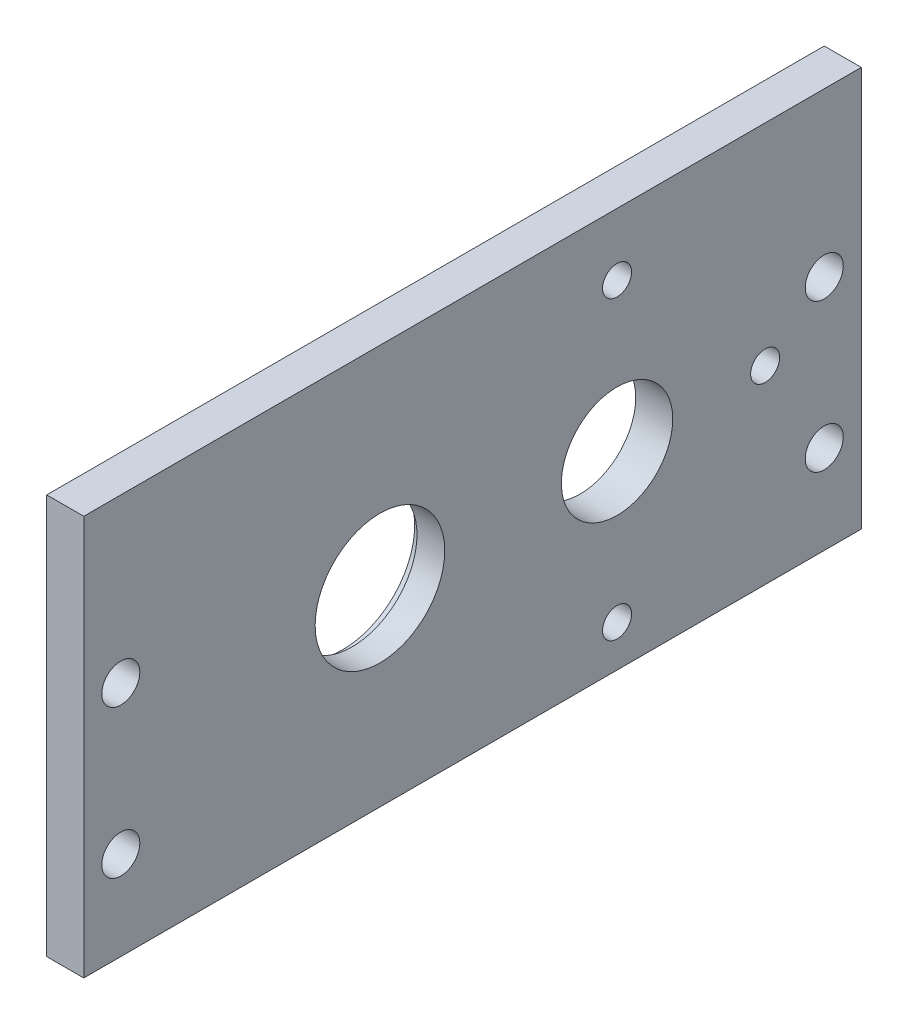
ISO-10303-21;
HEADER;
FILE_DESCRIPTION(('STEP AP214'),'2;1');
FILE_NAME('part.step','',(''),(''),'','','');
FILE_SCHEMA(('AUTOMOTIVE_DESIGN { 1 0 10303 214 1 1 1 1 }'));
ENDSEC;
DATA;
#1=APPLICATION_CONTEXT('core data for automotive mechanical design processes');
#2=APPLICATION_PROTOCOL_DEFINITION('international standard','automotive_design',2000,#1);
#3=PRODUCT_CONTEXT('',#1,'mechanical');
#4=PRODUCT('Part','Part','',(#3));
#5=PRODUCT_RELATED_PRODUCT_CATEGORY('part','',(#4));
#6=PRODUCT_DEFINITION_FORMATION('','',#4);
#7=PRODUCT_DEFINITION_CONTEXT('part definition',#1,'design');
#8=PRODUCT_DEFINITION('design','',#6,#7);
#9=PRODUCT_DEFINITION_SHAPE('','',#8);
#10=(LENGTH_UNIT() NAMED_UNIT(*) SI_UNIT(.MILLI.,.METRE.));
#11=(NAMED_UNIT(*) PLANE_ANGLE_UNIT() SI_UNIT($,.RADIAN.));
#12=(NAMED_UNIT(*) SI_UNIT($,.STERADIAN.) SOLID_ANGLE_UNIT());
#13=UNCERTAINTY_MEASURE_WITH_UNIT(LENGTH_MEASURE(1.E-05),#10,'distance_accuracy_value','');
#14=(GEOMETRIC_REPRESENTATION_CONTEXT(3) GLOBAL_UNCERTAINTY_ASSIGNED_CONTEXT((#13)) GLOBAL_UNIT_ASSIGNED_CONTEXT((#10,
#11,#12)) REPRESENTATION_CONTEXT('',''));
#15=CARTESIAN_POINT('',(0.,0.,0.));
#16=DIRECTION('',(0.,0.,1.));
#17=DIRECTION('',(1.,0.,0.));
#18=AXIS2_PLACEMENT_3D('',#15,#16,#17);
#19=CARTESIAN_POINT('',(6.35,0.,0.));
#20=DIRECTION('',(-1.,0.,0.));
#21=DIRECTION('',(0.,0.,1.));
#22=AXIS2_PLACEMENT_3D('',#19,#20,#21);
#23=CYLINDRICAL_SURFACE('',#22,11.1125);
#24=CARTESIAN_POINT('',(6.35,0.,0.));
#25=DIRECTION('',(1.,0.,0.));
#26=DIRECTION('',(0.,0.,-1.));
#27=AXIS2_PLACEMENT_3D('',#24,#25,#26);
#28=CIRCLE('',#27,11.1125);
#29=CARTESIAN_POINT('',(6.35,0.,-11.1125));
#30=VERTEX_POINT('',#29);
#31=EDGE_CURVE('E107',#30,#30,#28,.T.);
#32=ORIENTED_EDGE('',*,*,#31,.T.);
#33=EDGE_LOOP('',(#32));
#34=FACE_BOUND('',#33,.T.);
#35=CARTESIAN_POINT('',(1.5875,0.,0.));
#36=DIRECTION('',(-1.,0.,0.));
#37=DIRECTION('',(0.,0.,1.));
#38=AXIS2_PLACEMENT_3D('',#35,#36,#37);
#39=CIRCLE('',#38,11.1125);
#40=CARTESIAN_POINT('',(1.5875,0.,11.1125));
#41=VERTEX_POINT('',#40);
#42=EDGE_CURVE('E41',#41,#41,#39,.T.);
#43=ORIENTED_EDGE('',*,*,#42,.T.);
#44=EDGE_LOOP('',(#43));
#45=FACE_BOUND('',#44,.T.);
#46=ADVANCED_FACE('F37',(#34,#45),#23,.F.);
#47=CARTESIAN_POINT('',(6.35,0.,0.));
#48=DIRECTION('',(1.,0.,0.));
#49=DIRECTION('',(0.,0.,-1.));
#50=AXIS2_PLACEMENT_3D('',#47,#48,#49);
#51=PLANE('',#50);
#52=CARTESIAN_POINT('',(6.35,-17.272,44.45));
#53=DIRECTION('',(1.,0.,0.));
#54=DIRECTION('',(0.,0.,-1.));
#55=AXIS2_PLACEMENT_3D('',#52,#53,#54);
#56=CIRCLE('',#55,3.2639);
#57=CARTESIAN_POINT('',(6.35,-17.272,41.1861));
#58=VERTEX_POINT('',#57);
#59=EDGE_CURVE('E155',#58,#58,#56,.T.);
#60=ORIENTED_EDGE('',*,*,#59,.F.);
#61=EDGE_LOOP('',(#60));
#62=FACE_BOUND('',#61,.T.);
#63=CARTESIAN_POINT('',(6.35,-17.272,-76.2));
#64=DIRECTION('',(1.,0.,0.));
#65=DIRECTION('',(0.,0.,-1.));
#66=AXIS2_PLACEMENT_3D('',#63,#64,#65);
#67=CIRCLE('',#66,3.26389999999999);
#68=CARTESIAN_POINT('',(6.35,-17.272,-79.4639));
#69=VERTEX_POINT('',#68);
#70=EDGE_CURVE('E143',#69,#69,#67,.T.);
#71=ORIENTED_EDGE('',*,*,#70,.F.);
#72=EDGE_LOOP('',(#71));
#73=FACE_BOUND('',#72,.T.);
#74=CARTESIAN_POINT('',(6.35,-25.4,-40.6654));
#75=DIRECTION('',(1.,0.,0.));
#76=DIRECTION('',(0.,0.,-1.));
#77=AXIS2_PLACEMENT_3D('',#74,#75,#76);
#78=CIRCLE('',#77,2.4892);
#79=CARTESIAN_POINT('',(6.35,-25.4,-43.1546));
#80=VERTEX_POINT('',#79);
#81=EDGE_CURVE('E131',#80,#80,#78,.T.);
#82=ORIENTED_EDGE('',*,*,#81,.F.);
#83=EDGE_LOOP('',(#82));
#84=FACE_BOUND('',#83,.T.);
#85=CARTESIAN_POINT('',(6.35,25.4,-40.6654));
#86=DIRECTION('',(1.,0.,0.));
#87=DIRECTION('',(0.,0.,-1.));
#88=AXIS2_PLACEMENT_3D('',#85,#86,#87);
#89=CIRCLE('',#88,2.4892);
#90=CARTESIAN_POINT('',(6.35,25.4,-43.1546));
#91=VERTEX_POINT('',#90);
#92=EDGE_CURVE('E121',#91,#91,#89,.T.);
#93=ORIENTED_EDGE('',*,*,#92,.F.);
#94=EDGE_LOOP('',(#93));
#95=FACE_BOUND('',#94,.T.);
#96=DIRECTION('',(0.,-1.,0.));
#97=VECTOR('',#96,1.);
#98=CARTESIAN_POINT('',(6.35,36.068,50.8));
#99=LINE('',#98,#97);
#100=CARTESIAN_POINT('',(6.35,36.068,50.8));
#101=VERTEX_POINT('',#100);
#102=CARTESIAN_POINT('',(6.35,-32.512,50.8));
#103=VERTEX_POINT('',#102);
#104=EDGE_CURVE('E91',#101,#103,#99,.T.);
#105=ORIENTED_EDGE('',*,*,#104,.T.);
#106=DIRECTION('',(0.,0.,-1.));
#107=VECTOR('',#106,1.);
#108=CARTESIAN_POINT('',(6.35,-32.512,50.8));
#109=LINE('',#108,#107);
#110=CARTESIAN_POINT('',(6.35,-32.512,-82.55));
#111=VERTEX_POINT('',#110);
#112=EDGE_CURVE('E85',#103,#111,#109,.T.);
#113=ORIENTED_EDGE('',*,*,#112,.T.);
#114=DIRECTION('',(0.,1.,0.));
#115=VECTOR('',#114,1.);
#116=CARTESIAN_POINT('',(6.35,36.068,-82.55));
#117=LINE('',#116,#115);
#118=CARTESIAN_POINT('',(6.35,36.068,-82.55));
#119=VERTEX_POINT('',#118);
#120=EDGE_CURVE('E89',#111,#119,#117,.T.);
#121=ORIENTED_EDGE('',*,*,#120,.T.);
#122=DIRECTION('',(0.,0.,1.));
#123=VECTOR('',#122,1.);
#124=CARTESIAN_POINT('',(6.35,36.068,50.8));
#125=LINE('',#124,#123);
#126=EDGE_CURVE('E55',#119,#101,#125,.T.);
#127=ORIENTED_EDGE('',*,*,#126,.T.);
#128=EDGE_LOOP('',(#105,#113,#121,#127));
#129=FACE_BOUND('',#128,.T.);
#130=ORIENTED_EDGE('',*,*,#31,.F.);
#131=EDGE_LOOP('',(#130));
#132=FACE_BOUND('',#131,.T.);
#133=CARTESIAN_POINT('',(6.35,0.,-40.6654));
#134=DIRECTION('',(1.,0.,0.));
#135=DIRECTION('',(0.,0.,-1.));
#136=AXIS2_PLACEMENT_3D('',#133,#134,#135);
#137=CIRCLE('',#136,9.5504);
#138=CARTESIAN_POINT('',(6.35,0.,-50.2158));
#139=VERTEX_POINT('',#138);
#140=EDGE_CURVE('E125',#139,#139,#137,.T.);
#141=ORIENTED_EDGE('',*,*,#140,.F.);
#142=EDGE_LOOP('',(#141));
#143=FACE_BOUND('',#142,.T.);
#144=CARTESIAN_POINT('',(6.35,0.,-66.0654));
#145=DIRECTION('',(1.,0.,0.));
#146=DIRECTION('',(0.,0.,-1.));
#147=AXIS2_PLACEMENT_3D('',#144,#145,#146);
#148=CIRCLE('',#147,2.4892);
#149=CARTESIAN_POINT('',(6.35,0.,-68.5546));
#150=VERTEX_POINT('',#149);
#151=EDGE_CURVE('E137',#150,#150,#148,.T.);
#152=ORIENTED_EDGE('',*,*,#151,.F.);
#153=EDGE_LOOP('',(#152));
#154=FACE_BOUND('',#153,.T.);
#155=CARTESIAN_POINT('',(6.35,8.128,-76.2));
#156=DIRECTION('',(1.,0.,0.));
#157=DIRECTION('',(0.,0.,-1.));
#158=AXIS2_PLACEMENT_3D('',#155,#156,#157);
#159=CIRCLE('',#158,3.26389999999999);
#160=CARTESIAN_POINT('',(6.35,8.128,-79.4639));
#161=VERTEX_POINT('',#160);
#162=EDGE_CURVE('E149',#161,#161,#159,.T.);
#163=ORIENTED_EDGE('',*,*,#162,.F.);
#164=EDGE_LOOP('',(#163));
#165=FACE_BOUND('',#164,.T.);
#166=CARTESIAN_POINT('',(6.35,8.128,44.45));
#167=DIRECTION('',(1.,0.,0.));
#168=DIRECTION('',(0.,0.,-1.));
#169=AXIS2_PLACEMENT_3D('',#166,#167,#168);
#170=CIRCLE('',#169,3.2639);
#171=CARTESIAN_POINT('',(6.35,8.128,41.1861));
#172=VERTEX_POINT('',#171);
#173=EDGE_CURVE('E161',#172,#172,#170,.T.);
#174=ORIENTED_EDGE('',*,*,#173,.F.);
#175=EDGE_LOOP('',(#174));
#176=FACE_BOUND('',#175,.T.);
#177=ADVANCED_FACE('F86',(#62,#73,#84,#95,#129,#132,#143,#154,#165,#176),#51,.T.);
#178=CARTESIAN_POINT('',(0.,0.,0.));
#179=DIRECTION('',(1.,0.,0.));
#180=DIRECTION('',(0.,0.,-1.));
#181=AXIS2_PLACEMENT_3D('',#178,#179,#180);
#182=PLANE('',#181);
#183=CARTESIAN_POINT('',(0.,0.,0.));
#184=DIRECTION('',(-1.,0.,0.));
#185=DIRECTION('',(0.,0.,1.));
#186=AXIS2_PLACEMENT_3D('',#183,#184,#185);
#187=CIRCLE('',#186,12.3063);
#188=CARTESIAN_POINT('',(0.,0.,12.3063));
#189=VERTEX_POINT('',#188);
#190=EDGE_CURVE('E169',#189,#189,#187,.T.);
#191=ORIENTED_EDGE('',*,*,#190,.F.);
#192=EDGE_LOOP('',(#191));
#193=FACE_BOUND('',#192,.T.);
#194=DIRECTION('',(0.,-1.,0.));
#195=VECTOR('',#194,1.);
#196=CARTESIAN_POINT('',(0.,36.068,50.8));
#197=LINE('',#196,#195);
#198=CARTESIAN_POINT('',(0.,36.068,50.8));
#199=VERTEX_POINT('',#198);
#200=CARTESIAN_POINT('',(0.,-32.512,50.8));
#201=VERTEX_POINT('',#200);
#202=EDGE_CURVE('E104',#199,#201,#197,.T.);
#203=ORIENTED_EDGE('',*,*,#202,.F.);
#204=DIRECTION('',(0.,0.,1.));
#205=VECTOR('',#204,1.);
#206=CARTESIAN_POINT('',(0.,36.068,50.8));
#207=LINE('',#206,#205);
#208=CARTESIAN_POINT('',(0.,36.068,-82.55));
#209=VERTEX_POINT('',#208);
#210=EDGE_CURVE('E78',#209,#199,#207,.T.);
#211=ORIENTED_EDGE('',*,*,#210,.F.);
#212=DIRECTION('',(0.,1.,0.));
#213=VECTOR('',#212,1.);
#214=CARTESIAN_POINT('',(0.,36.068,-82.55));
#215=LINE('',#214,#213);
#216=CARTESIAN_POINT('',(0.,-32.512,-82.55));
#217=VERTEX_POINT('',#216);
#218=EDGE_CURVE('E72',#217,#209,#215,.T.);
#219=ORIENTED_EDGE('',*,*,#218,.F.);
#220=DIRECTION('',(0.,0.,-1.));
#221=VECTOR('',#220,1.);
#222=CARTESIAN_POINT('',(0.,-32.512,50.8));
#223=LINE('',#222,#221);
#224=EDGE_CURVE('E95',#201,#217,#223,.T.);
#225=ORIENTED_EDGE('',*,*,#224,.F.);
#226=EDGE_LOOP('',(#203,#211,#219,#225));
#227=FACE_BOUND('',#226,.T.);
#228=CARTESIAN_POINT('',(0.,25.4,-40.6654));
#229=DIRECTION('',(1.,0.,0.));
#230=DIRECTION('',(0.,0.,-1.));
#231=AXIS2_PLACEMENT_3D('',#228,#229,#230);
#232=CIRCLE('',#231,2.4892);
#233=CARTESIAN_POINT('',(0.,25.4,-43.1546));
#234=VERTEX_POINT('',#233);
#235=EDGE_CURVE('E122',#234,#234,#232,.T.);
#236=ORIENTED_EDGE('',*,*,#235,.T.);
#237=EDGE_LOOP('',(#236));
#238=FACE_BOUND('',#237,.T.);
#239=CARTESIAN_POINT('',(0.,0.,-40.6654));
#240=DIRECTION('',(1.,0.,0.));
#241=DIRECTION('',(0.,0.,-1.));
#242=AXIS2_PLACEMENT_3D('',#239,#240,#241);
#243=CIRCLE('',#242,9.5504);
#244=CARTESIAN_POINT('',(0.,0.,-50.2158));
#245=VERTEX_POINT('',#244);
#246=EDGE_CURVE('E128',#245,#245,#243,.T.);
#247=ORIENTED_EDGE('',*,*,#246,.T.);
#248=EDGE_LOOP('',(#247));
#249=FACE_BOUND('',#248,.T.);
#250=CARTESIAN_POINT('',(0.,-25.4,-40.6654));
#251=DIRECTION('',(1.,0.,0.));
#252=DIRECTION('',(0.,0.,-1.));
#253=AXIS2_PLACEMENT_3D('',#250,#251,#252);
#254=CIRCLE('',#253,2.4892);
#255=CARTESIAN_POINT('',(0.,-25.4,-43.1546));
#256=VERTEX_POINT('',#255);
#257=EDGE_CURVE('E134',#256,#256,#254,.T.);
#258=ORIENTED_EDGE('',*,*,#257,.T.);
#259=EDGE_LOOP('',(#258));
#260=FACE_BOUND('',#259,.T.);
#261=CARTESIAN_POINT('',(0.,0.,-66.0654));
#262=DIRECTION('',(1.,0.,0.));
#263=DIRECTION('',(0.,0.,-1.));
#264=AXIS2_PLACEMENT_3D('',#261,#262,#263);
#265=CIRCLE('',#264,2.4892);
#266=CARTESIAN_POINT('',(0.,0.,-68.5546));
#267=VERTEX_POINT('',#266);
#268=EDGE_CURVE('E140',#267,#267,#265,.T.);
#269=ORIENTED_EDGE('',*,*,#268,.T.);
#270=EDGE_LOOP('',(#269));
#271=FACE_BOUND('',#270,.T.);
#272=CARTESIAN_POINT('',(0.,-17.272,-76.2));
#273=DIRECTION('',(1.,0.,0.));
#274=DIRECTION('',(0.,0.,-1.));
#275=AXIS2_PLACEMENT_3D('',#272,#273,#274);
#276=CIRCLE('',#275,3.26389999999999);
#277=CARTESIAN_POINT('',(0.,-17.272,-79.4639));
#278=VERTEX_POINT('',#277);
#279=EDGE_CURVE('E146',#278,#278,#276,.T.);
#280=ORIENTED_EDGE('',*,*,#279,.T.);
#281=EDGE_LOOP('',(#280));
#282=FACE_BOUND('',#281,.T.);
#283=CARTESIAN_POINT('',(0.,8.128,-76.2));
#284=DIRECTION('',(1.,0.,0.));
#285=DIRECTION('',(0.,0.,-1.));
#286=AXIS2_PLACEMENT_3D('',#283,#284,#285);
#287=CIRCLE('',#286,3.26389999999999);
#288=CARTESIAN_POINT('',(0.,8.128,-79.4639));
#289=VERTEX_POINT('',#288);
#290=EDGE_CURVE('E152',#289,#289,#287,.T.);
#291=ORIENTED_EDGE('',*,*,#290,.T.);
#292=EDGE_LOOP('',(#291));
#293=FACE_BOUND('',#292,.T.);
#294=CARTESIAN_POINT('',(0.,-17.272,44.45));
#295=DIRECTION('',(1.,0.,0.));
#296=DIRECTION('',(0.,0.,-1.));
#297=AXIS2_PLACEMENT_3D('',#294,#295,#296);
#298=CIRCLE('',#297,3.2639);
#299=CARTESIAN_POINT('',(0.,-17.272,41.1861));
#300=VERTEX_POINT('',#299);
#301=EDGE_CURVE('E158',#300,#300,#298,.T.);
#302=ORIENTED_EDGE('',*,*,#301,.T.);
#303=EDGE_LOOP('',(#302));
#304=FACE_BOUND('',#303,.T.);
#305=CARTESIAN_POINT('',(0.,8.128,44.45));
#306=DIRECTION('',(1.,0.,0.));
#307=DIRECTION('',(0.,0.,-1.));
#308=AXIS2_PLACEMENT_3D('',#305,#306,#307);
#309=CIRCLE('',#308,3.2639);
#310=CARTESIAN_POINT('',(0.,8.128,41.1861));
#311=VERTEX_POINT('',#310);
#312=EDGE_CURVE('E164',#311,#311,#309,.T.);
#313=ORIENTED_EDGE('',*,*,#312,.T.);
#314=EDGE_LOOP('',(#313));
#315=FACE_BOUND('',#314,.T.);
#316=ADVANCED_FACE('F115',(#193,#227,#238,#249,#260,#271,#282,#293,#304,#315),#182,.F.);
#317=CARTESIAN_POINT('',(6.35,36.068,50.8));
#318=DIRECTION('',(0.,0.,-1.));
#319=DIRECTION('',(0.,1.,0.));
#320=AXIS2_PLACEMENT_3D('',#317,#318,#319);
#321=PLANE('',#320);
#322=ORIENTED_EDGE('',*,*,#202,.T.);
#323=DIRECTION('',(-1.,0.,0.));
#324=VECTOR('',#323,1.);
#325=CARTESIAN_POINT('',(6.35,-32.512,50.8));
#326=LINE('',#325,#324);
#327=EDGE_CURVE('E11',#103,#201,#326,.T.);
#328=ORIENTED_EDGE('',*,*,#327,.F.);
#329=ORIENTED_EDGE('',*,*,#104,.F.);
#330=DIRECTION('',(-1.,0.,0.));
#331=VECTOR('',#330,1.);
#332=CARTESIAN_POINT('',(6.35,36.068,50.8));
#333=LINE('',#332,#331);
#334=EDGE_CURVE('E100',#101,#199,#333,.T.);
#335=ORIENTED_EDGE('',*,*,#334,.T.);
#336=EDGE_LOOP('',(#322,#328,#329,#335));
#337=FACE_BOUND('',#336,.T.);
#338=ADVANCED_FACE('F39',(#337),#321,.F.);
#339=CARTESIAN_POINT('',(6.35,-32.512,50.8));
#340=DIRECTION('',(0.,1.,0.));
#341=DIRECTION('',(0.,0.,1.));
#342=AXIS2_PLACEMENT_3D('',#339,#340,#341);
#343=PLANE('',#342);
#344=ORIENTED_EDGE('',*,*,#224,.T.);
#345=DIRECTION('',(-1.,0.,0.));
#346=VECTOR('',#345,1.);
#347=CARTESIAN_POINT('',(6.35,-32.512,-82.55));
#348=LINE('',#347,#346);
#349=EDGE_CURVE('E47',#111,#217,#348,.T.);
#350=ORIENTED_EDGE('',*,*,#349,.F.);
#351=ORIENTED_EDGE('',*,*,#112,.F.);
#352=ORIENTED_EDGE('',*,*,#327,.T.);
#353=EDGE_LOOP('',(#344,#350,#351,#352));
#354=FACE_BOUND('',#353,.T.);
#355=ADVANCED_FACE('F94',(#354),#343,.F.);
#356=CARTESIAN_POINT('',(6.35,36.068,-82.55));
#357=DIRECTION('',(0.,0.,1.));
#358=DIRECTION('',(0.,-1.,0.));
#359=AXIS2_PLACEMENT_3D('',#356,#357,#358);
#360=PLANE('',#359);
#361=ORIENTED_EDGE('',*,*,#218,.T.);
#362=DIRECTION('',(-1.,0.,0.));
#363=VECTOR('',#362,1.);
#364=CARTESIAN_POINT('',(6.35,36.068,-82.55));
#365=LINE('',#364,#363);
#366=EDGE_CURVE('E96',#119,#209,#365,.T.);
#367=ORIENTED_EDGE('',*,*,#366,.F.);
#368=ORIENTED_EDGE('',*,*,#120,.F.);
#369=ORIENTED_EDGE('',*,*,#349,.T.);
#370=EDGE_LOOP('',(#361,#367,#368,#369));
#371=FACE_BOUND('',#370,.T.);
#372=ADVANCED_FACE('F98',(#371),#360,.F.);
#373=CARTESIAN_POINT('',(6.35,36.068,50.8));
#374=DIRECTION('',(0.,-1.,0.));
#375=DIRECTION('',(0.,0.,-1.));
#376=AXIS2_PLACEMENT_3D('',#373,#374,#375);
#377=PLANE('',#376);
#378=ORIENTED_EDGE('',*,*,#210,.T.);
#379=ORIENTED_EDGE('',*,*,#334,.F.);
#380=ORIENTED_EDGE('',*,*,#126,.F.);
#381=ORIENTED_EDGE('',*,*,#366,.T.);
#382=EDGE_LOOP('',(#378,#379,#380,#381));
#383=FACE_BOUND('',#382,.T.);
#384=ADVANCED_FACE('F112',(#383),#377,.F.);
#385=CARTESIAN_POINT('',(6.35,25.4,-40.6654));
#386=DIRECTION('',(-1.,0.,0.));
#387=DIRECTION('',(0.,0.,1.));
#388=AXIS2_PLACEMENT_3D('',#385,#386,#387);
#389=CYLINDRICAL_SURFACE('',#388,2.4892);
#390=ORIENTED_EDGE('',*,*,#92,.T.);
#391=EDGE_LOOP('',(#390));
#392=FACE_BOUND('',#391,.T.);
#393=ORIENTED_EDGE('',*,*,#235,.F.);
#394=EDGE_LOOP('',(#393));
#395=FACE_BOUND('',#394,.T.);
#396=ADVANCED_FACE('F199',(#392,#395),#389,.F.);
#397=CARTESIAN_POINT('',(6.35,0.,-40.6654));
#398=DIRECTION('',(-1.,0.,0.));
#399=DIRECTION('',(0.,0.,1.));
#400=AXIS2_PLACEMENT_3D('',#397,#398,#399);
#401=CYLINDRICAL_SURFACE('',#400,9.5504);
#402=ORIENTED_EDGE('',*,*,#140,.T.);
#403=EDGE_LOOP('',(#402));
#404=FACE_BOUND('',#403,.T.);
#405=ORIENTED_EDGE('',*,*,#246,.F.);
#406=EDGE_LOOP('',(#405));
#407=FACE_BOUND('',#406,.T.);
#408=ADVANCED_FACE('F264',(#404,#407),#401,.F.);
#409=CARTESIAN_POINT('',(6.35,-25.4,-40.6654));
#410=DIRECTION('',(-1.,0.,0.));
#411=DIRECTION('',(0.,0.,1.));
#412=AXIS2_PLACEMENT_3D('',#409,#410,#411);
#413=CYLINDRICAL_SURFACE('',#412,2.4892);
#414=ORIENTED_EDGE('',*,*,#81,.T.);
#415=EDGE_LOOP('',(#414));
#416=FACE_BOUND('',#415,.T.);
#417=ORIENTED_EDGE('',*,*,#257,.F.);
#418=EDGE_LOOP('',(#417));
#419=FACE_BOUND('',#418,.T.);
#420=ADVANCED_FACE('F274',(#416,#419),#413,.F.);
#421=CARTESIAN_POINT('',(6.35,0.,-66.0654));
#422=DIRECTION('',(-1.,0.,0.));
#423=DIRECTION('',(0.,0.,1.));
#424=AXIS2_PLACEMENT_3D('',#421,#422,#423);
#425=CYLINDRICAL_SURFACE('',#424,2.4892);
#426=ORIENTED_EDGE('',*,*,#151,.T.);
#427=EDGE_LOOP('',(#426));
#428=FACE_BOUND('',#427,.T.);
#429=ORIENTED_EDGE('',*,*,#268,.F.);
#430=EDGE_LOOP('',(#429));
#431=FACE_BOUND('',#430,.T.);
#432=ADVANCED_FACE('F284',(#428,#431),#425,.F.);
#433=CARTESIAN_POINT('',(6.35,-17.272,-76.2));
#434=DIRECTION('',(-1.,0.,0.));
#435=DIRECTION('',(0.,0.,1.));
#436=AXIS2_PLACEMENT_3D('',#433,#434,#435);
#437=CYLINDRICAL_SURFACE('',#436,3.26389999999999);
#438=ORIENTED_EDGE('',*,*,#70,.T.);
#439=EDGE_LOOP('',(#438));
#440=FACE_BOUND('',#439,.T.);
#441=ORIENTED_EDGE('',*,*,#279,.F.);
#442=EDGE_LOOP('',(#441));
#443=FACE_BOUND('',#442,.T.);
#444=ADVANCED_FACE('F295',(#440,#443),#437,.F.);
#445=CARTESIAN_POINT('',(6.35,8.128,-76.2));
#446=DIRECTION('',(-1.,0.,0.));
#447=DIRECTION('',(0.,0.,1.));
#448=AXIS2_PLACEMENT_3D('',#445,#446,#447);
#449=CYLINDRICAL_SURFACE('',#448,3.26389999999999);
#450=ORIENTED_EDGE('',*,*,#162,.T.);
#451=EDGE_LOOP('',(#450));
#452=FACE_BOUND('',#451,.T.);
#453=ORIENTED_EDGE('',*,*,#290,.F.);
#454=EDGE_LOOP('',(#453));
#455=FACE_BOUND('',#454,.T.);
#456=ADVANCED_FACE('F306',(#452,#455),#449,.F.);
#457=CARTESIAN_POINT('',(6.35,-17.272,44.45));
#458=DIRECTION('',(-1.,0.,0.));
#459=DIRECTION('',(0.,0.,1.));
#460=AXIS2_PLACEMENT_3D('',#457,#458,#459);
#461=CYLINDRICAL_SURFACE('',#460,3.2639);
#462=ORIENTED_EDGE('',*,*,#59,.T.);
#463=EDGE_LOOP('',(#462));
#464=FACE_BOUND('',#463,.T.);
#465=ORIENTED_EDGE('',*,*,#301,.F.);
#466=EDGE_LOOP('',(#465));
#467=FACE_BOUND('',#466,.T.);
#468=ADVANCED_FACE('F317',(#464,#467),#461,.F.);
#469=CARTESIAN_POINT('',(6.35,8.128,44.45));
#470=DIRECTION('',(-1.,0.,0.));
#471=DIRECTION('',(0.,0.,1.));
#472=AXIS2_PLACEMENT_3D('',#469,#470,#471);
#473=CYLINDRICAL_SURFACE('',#472,3.2639);
#474=ORIENTED_EDGE('',*,*,#173,.T.);
#475=EDGE_LOOP('',(#474));
#476=FACE_BOUND('',#475,.T.);
#477=ORIENTED_EDGE('',*,*,#312,.F.);
#478=EDGE_LOOP('',(#477));
#479=FACE_BOUND('',#478,.T.);
#480=ADVANCED_FACE('F187',(#476,#479),#473,.F.);
#481=CARTESIAN_POINT('',(1.5875,0.,0.));
#482=DIRECTION('',(-1.,0.,0.));
#483=DIRECTION('',(0.,0.,1.));
#484=AXIS2_PLACEMENT_3D('',#481,#482,#483);
#485=CYLINDRICAL_SURFACE('',#484,12.3063);
#486=CARTESIAN_POINT('',(1.5875,0.,0.));
#487=DIRECTION('',(-1.,0.,0.));
#488=DIRECTION('',(0.,0.,1.));
#489=AXIS2_PLACEMENT_3D('',#486,#487,#488);
#490=CIRCLE('',#489,12.3063);
#491=CARTESIAN_POINT('',(1.5875,0.,12.3063));
#492=VERTEX_POINT('',#491);
#493=EDGE_CURVE('E172',#492,#492,#490,.T.);
#494=ORIENTED_EDGE('',*,*,#493,.F.);
#495=EDGE_LOOP('',(#494));
#496=FACE_BOUND('',#495,.T.);
#497=ORIENTED_EDGE('',*,*,#190,.T.);
#498=EDGE_LOOP('',(#497));
#499=FACE_BOUND('',#498,.T.);
#500=ADVANCED_FACE('F182',(#496,#499),#485,.F.);
#501=CARTESIAN_POINT('',(1.5875,0.,0.));
#502=DIRECTION('',(-1.,0.,0.));
#503=DIRECTION('',(0.,0.,1.));
#504=AXIS2_PLACEMENT_3D('',#501,#502,#503);
#505=PLANE('',#504);
#506=ORIENTED_EDGE('',*,*,#42,.F.);
#507=EDGE_LOOP('',(#506));
#508=FACE_BOUND('',#507,.T.);
#509=ORIENTED_EDGE('',*,*,#493,.T.);
#510=EDGE_LOOP('',(#509));
#511=FACE_BOUND('',#510,.T.);
#512=ADVANCED_FACE('F180',(#508,#511),#505,.T.);
#513=CLOSED_SHELL('',(#46,#177,#316,#338,#355,#372,#384,#396,#408,#420,#432,#444,#456,#468,#480,
#500,#512));
#514=MANIFOLD_SOLID_BREP('B2',#513);
#515=ADVANCED_BREP_SHAPE_REPRESENTATION('',(#18,#514),#14);
#516=SHAPE_DEFINITION_REPRESENTATION(#9,#515);
ENDSEC;
END-ISO-10303-21;
